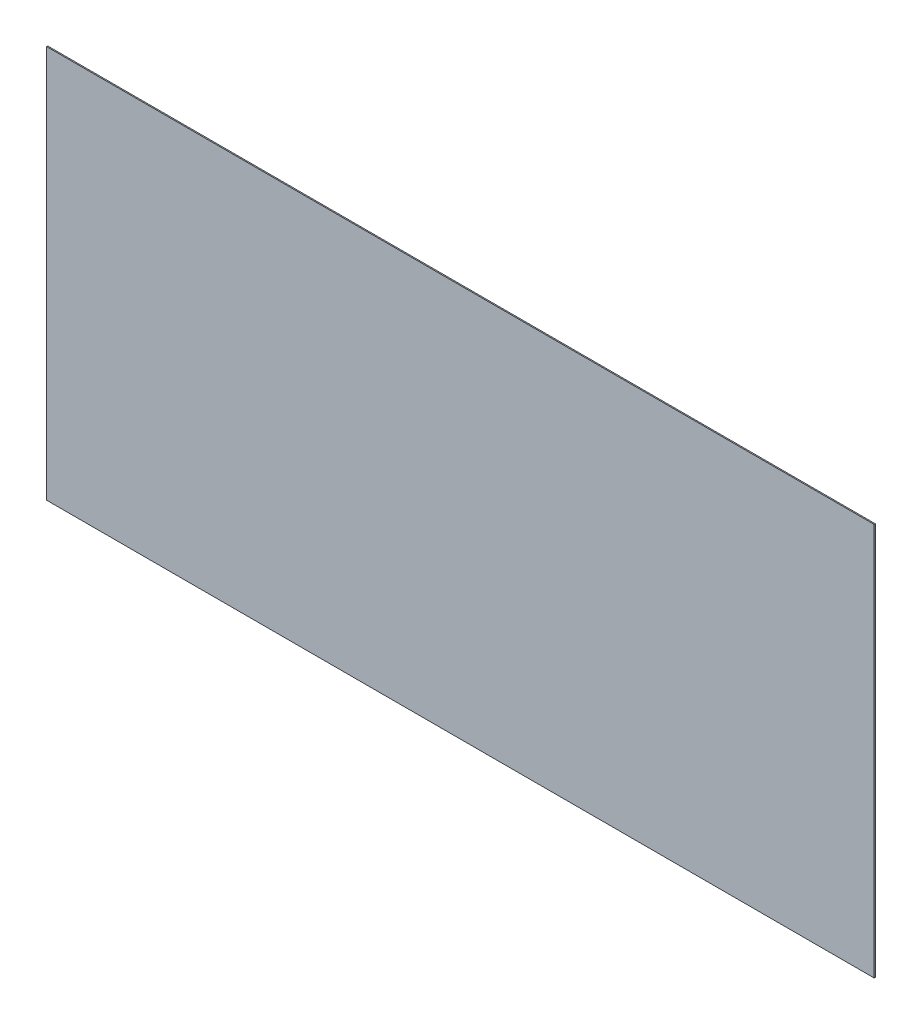
ISO-10303-21;
HEADER;
FILE_DESCRIPTION(('STEP AP214'),'2;1');
FILE_NAME('part.step','',(''),(''),'','','');
FILE_SCHEMA(('AUTOMOTIVE_DESIGN { 1 0 10303 214 1 1 1 1 }'));
ENDSEC;
DATA;
#1=APPLICATION_CONTEXT('core data for automotive mechanical design processes');
#2=APPLICATION_PROTOCOL_DEFINITION('international standard','automotive_design',2000,#1);
#3=PRODUCT_CONTEXT('',#1,'mechanical');
#4=PRODUCT('Part','Part','',(#3));
#5=PRODUCT_RELATED_PRODUCT_CATEGORY('part','',(#4));
#6=PRODUCT_DEFINITION_FORMATION('','',#4);
#7=PRODUCT_DEFINITION_CONTEXT('part definition',#1,'design');
#8=PRODUCT_DEFINITION('design','',#6,#7);
#9=PRODUCT_DEFINITION_SHAPE('','',#8);
#10=(LENGTH_UNIT() NAMED_UNIT(*) SI_UNIT(.MILLI.,.METRE.));
#11=(NAMED_UNIT(*) PLANE_ANGLE_UNIT() SI_UNIT($,.RADIAN.));
#12=(NAMED_UNIT(*) SI_UNIT($,.STERADIAN.) SOLID_ANGLE_UNIT());
#13=UNCERTAINTY_MEASURE_WITH_UNIT(LENGTH_MEASURE(1.E-05),#10,'distance_accuracy_value','');
#14=(GEOMETRIC_REPRESENTATION_CONTEXT(3) GLOBAL_UNCERTAINTY_ASSIGNED_CONTEXT((#13)) GLOBAL_UNIT_ASSIGNED_CONTEXT((#10,
#11,#12)) REPRESENTATION_CONTEXT('',''));
#15=CARTESIAN_POINT('',(0.,0.,0.));
#16=DIRECTION('',(0.,0.,1.));
#17=DIRECTION('',(1.,0.,0.));
#18=AXIS2_PLACEMENT_3D('',#15,#16,#17);
#19=CARTESIAN_POINT('',(370.,175.67,-1.));
#20=DIRECTION('',(1.,0.,0.));
#21=DIRECTION('',(0.,1.,0.));
#22=AXIS2_PLACEMENT_3D('',#19,#20,#21);
#23=PLANE('',#22);
#24=DIRECTION('',(0.,1.,0.));
#25=VECTOR('',#24,1.);
#26=CARTESIAN_POINT('',(370.,175.67,0.));
#27=LINE('',#26,#25);
#28=CARTESIAN_POINT('',(370.,-175.67,0.));
#29=VERTEX_POINT('',#28);
#30=CARTESIAN_POINT('',(370.,175.67,0.));
#31=VERTEX_POINT('',#30);
#32=EDGE_CURVE('E102',#29,#31,#27,.T.);
#33=ORIENTED_EDGE('',*,*,#32,.F.);
#34=DIRECTION('',(0.,0.,1.));
#35=VECTOR('',#34,1.);
#36=CARTESIAN_POINT('',(370.,-175.67,-1.));
#37=LINE('',#36,#35);
#38=CARTESIAN_POINT('',(370.,-175.67,-1.));
#39=VERTEX_POINT('',#38);
#40=EDGE_CURVE('E11',#39,#29,#37,.T.);
#41=ORIENTED_EDGE('',*,*,#40,.F.);
#42=DIRECTION('',(0.,1.,0.));
#43=VECTOR('',#42,1.);
#44=CARTESIAN_POINT('',(370.,175.67,-1.));
#45=LINE('',#44,#43);
#46=CARTESIAN_POINT('',(370.,175.67,-1.));
#47=VERTEX_POINT('',#46);
#48=EDGE_CURVE('E96',#39,#47,#45,.T.);
#49=ORIENTED_EDGE('',*,*,#48,.T.);
#50=DIRECTION('',(0.,0.,1.));
#51=VECTOR('',#50,1.);
#52=CARTESIAN_POINT('',(370.,175.67,-1.));
#53=LINE('',#52,#51);
#54=EDGE_CURVE('E41',#47,#31,#53,.T.);
#55=ORIENTED_EDGE('',*,*,#54,.T.);
#56=EDGE_LOOP('',(#33,#41,#49,#55));
#57=FACE_BOUND('',#56,.T.);
#58=ADVANCED_FACE('F38',(#57),#23,.T.);
#59=CARTESIAN_POINT('',(-370.,-175.67,-1.));
#60=DIRECTION('',(0.,-1.,0.));
#61=DIRECTION('',(0.,0.,-1.));
#62=AXIS2_PLACEMENT_3D('',#59,#60,#61);
#63=PLANE('',#62);
#64=DIRECTION('',(1.,0.,0.));
#65=VECTOR('',#64,1.);
#66=CARTESIAN_POINT('',(-370.,-175.67,0.));
#67=LINE('',#66,#65);
#68=CARTESIAN_POINT('',(-370.,-175.67,0.));
#69=VERTEX_POINT('',#68);
#70=EDGE_CURVE('E98',#69,#29,#67,.T.);
#71=ORIENTED_EDGE('',*,*,#70,.F.);
#72=DIRECTION('',(0.,0.,1.));
#73=VECTOR('',#72,1.);
#74=CARTESIAN_POINT('',(-370.,-175.67,-1.));
#75=LINE('',#74,#73);
#76=CARTESIAN_POINT('',(-370.,-175.67,-1.));
#77=VERTEX_POINT('',#76);
#78=EDGE_CURVE('E47',#77,#69,#75,.T.);
#79=ORIENTED_EDGE('',*,*,#78,.F.);
#80=DIRECTION('',(1.,0.,0.));
#81=VECTOR('',#80,1.);
#82=CARTESIAN_POINT('',(-370.,-175.67,-1.));
#83=LINE('',#82,#81);
#84=EDGE_CURVE('E93',#77,#39,#83,.T.);
#85=ORIENTED_EDGE('',*,*,#84,.T.);
#86=ORIENTED_EDGE('',*,*,#40,.T.);
#87=EDGE_LOOP('',(#71,#79,#85,#86));
#88=FACE_BOUND('',#87,.T.);
#89=ADVANCED_FACE('F112',(#88),#63,.T.);
#90=CARTESIAN_POINT('',(-370.,175.67,-1.));
#91=DIRECTION('',(-1.,0.,0.));
#92=DIRECTION('',(0.,-1.,0.));
#93=AXIS2_PLACEMENT_3D('',#90,#91,#92);
#94=PLANE('',#93);
#95=DIRECTION('',(0.,-1.,0.));
#96=VECTOR('',#95,1.);
#97=CARTESIAN_POINT('',(-370.,175.67,0.));
#98=LINE('',#97,#96);
#99=CARTESIAN_POINT('',(-370.,175.67,0.));
#100=VERTEX_POINT('',#99);
#101=EDGE_CURVE('E88',#100,#69,#98,.T.);
#102=ORIENTED_EDGE('',*,*,#101,.F.);
#103=DIRECTION('',(0.,0.,1.));
#104=VECTOR('',#103,1.);
#105=CARTESIAN_POINT('',(-370.,175.67,-1.));
#106=LINE('',#105,#104);
#107=CARTESIAN_POINT('',(-370.,175.67,-1.));
#108=VERTEX_POINT('',#107);
#109=EDGE_CURVE('E83',#108,#100,#106,.T.);
#110=ORIENTED_EDGE('',*,*,#109,.F.);
#111=DIRECTION('',(0.,-1.,0.));
#112=VECTOR('',#111,1.);
#113=CARTESIAN_POINT('',(-370.,175.67,-1.));
#114=LINE('',#113,#112);
#115=EDGE_CURVE('E86',#108,#77,#114,.T.);
#116=ORIENTED_EDGE('',*,*,#115,.T.);
#117=ORIENTED_EDGE('',*,*,#78,.T.);
#118=EDGE_LOOP('',(#102,#110,#116,#117));
#119=FACE_BOUND('',#118,.T.);
#120=ADVANCED_FACE('F85',(#119),#94,.T.);
#121=CARTESIAN_POINT('',(-370.,175.67,-1.));
#122=DIRECTION('',(0.,1.,0.));
#123=DIRECTION('',(0.,0.,1.));
#124=AXIS2_PLACEMENT_3D('',#121,#122,#123);
#125=PLANE('',#124);
#126=DIRECTION('',(-1.,0.,0.));
#127=VECTOR('',#126,1.);
#128=CARTESIAN_POINT('',(-370.,175.67,0.));
#129=LINE('',#128,#127);
#130=EDGE_CURVE('E105',#31,#100,#129,.T.);
#131=ORIENTED_EDGE('',*,*,#130,.F.);
#132=ORIENTED_EDGE('',*,*,#54,.F.);
#133=DIRECTION('',(-1.,0.,0.));
#134=VECTOR('',#133,1.);
#135=CARTESIAN_POINT('',(-370.,175.67,-1.));
#136=LINE('',#135,#134);
#137=EDGE_CURVE('E92',#47,#108,#136,.T.);
#138=ORIENTED_EDGE('',*,*,#137,.T.);
#139=ORIENTED_EDGE('',*,*,#109,.T.);
#140=EDGE_LOOP('',(#131,#132,#138,#139));
#141=FACE_BOUND('',#140,.T.);
#142=ADVANCED_FACE('F95',(#141),#125,.T.);
#143=CARTESIAN_POINT('',(0.,0.,-1.));
#144=DIRECTION('',(0.,0.,1.));
#145=DIRECTION('',(1.,0.,0.));
#146=AXIS2_PLACEMENT_3D('',#143,#144,#145);
#147=PLANE('',#146);
#148=ORIENTED_EDGE('',*,*,#48,.F.);
#149=ORIENTED_EDGE('',*,*,#84,.F.);
#150=ORIENTED_EDGE('',*,*,#115,.F.);
#151=ORIENTED_EDGE('',*,*,#137,.F.);
#152=EDGE_LOOP('',(#148,#149,#150,#151));
#153=FACE_BOUND('',#152,.T.);
#154=ADVANCED_FACE('F91',(#153),#147,.F.);
#155=CARTESIAN_POINT('',(0.,0.,0.));
#156=DIRECTION('',(0.,0.,1.));
#157=DIRECTION('',(1.,0.,0.));
#158=AXIS2_PLACEMENT_3D('',#155,#156,#157);
#159=PLANE('',#158);
#160=ORIENTED_EDGE('',*,*,#32,.T.);
#161=ORIENTED_EDGE('',*,*,#130,.T.);
#162=ORIENTED_EDGE('',*,*,#101,.T.);
#163=ORIENTED_EDGE('',*,*,#70,.T.);
#164=EDGE_LOOP('',(#160,#161,#162,#163));
#165=FACE_BOUND('',#164,.T.);
#166=ADVANCED_FACE('F111',(#165),#159,.T.);
#167=CLOSED_SHELL('',(#58,#89,#120,#142,#154,#166));
#168=MANIFOLD_SOLID_BREP('B2',#167);
#169=ADVANCED_BREP_SHAPE_REPRESENTATION('',(#18,#168),#14);
#170=SHAPE_DEFINITION_REPRESENTATION(#9,#169);
ENDSEC;
END-ISO-10303-21;
